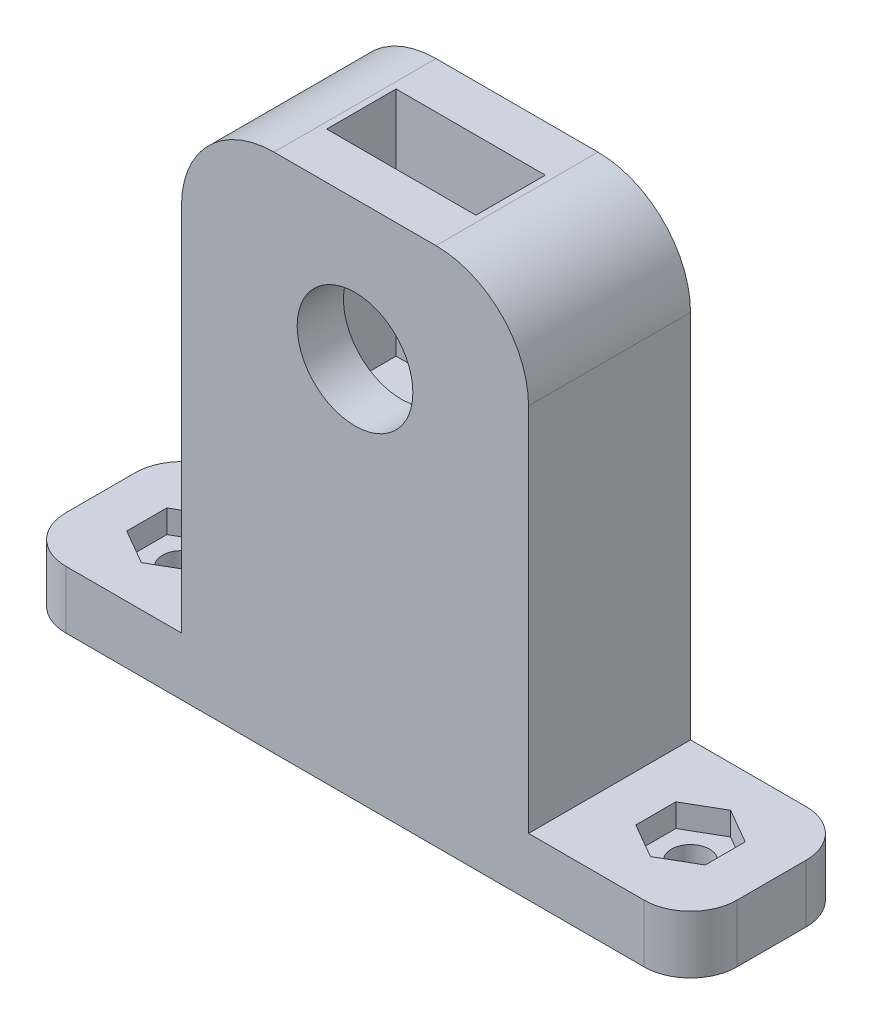
ISO-10303-21;
HEADER;
FILE_DESCRIPTION(('STEP AP214'),'2;1');
FILE_NAME('part.step','',(''),(''),'','','');
FILE_SCHEMA(('AUTOMOTIVE_DESIGN { 1 0 10303 214 1 1 1 1 }'));
ENDSEC;
DATA;
#1=APPLICATION_CONTEXT('core data for automotive mechanical design processes');
#2=APPLICATION_PROTOCOL_DEFINITION('international standard','automotive_design',2000,#1);
#3=PRODUCT_CONTEXT('',#1,'mechanical');
#4=PRODUCT('Part','Part','',(#3));
#5=PRODUCT_RELATED_PRODUCT_CATEGORY('part','',(#4));
#6=PRODUCT_DEFINITION_FORMATION('','',#4);
#7=PRODUCT_DEFINITION_CONTEXT('part definition',#1,'design');
#8=PRODUCT_DEFINITION('design','',#6,#7);
#9=PRODUCT_DEFINITION_SHAPE('','',#8);
#10=(LENGTH_UNIT() NAMED_UNIT(*) SI_UNIT(.MILLI.,.METRE.));
#11=(NAMED_UNIT(*) PLANE_ANGLE_UNIT() SI_UNIT($,.RADIAN.));
#12=(NAMED_UNIT(*) SI_UNIT($,.STERADIAN.) SOLID_ANGLE_UNIT());
#13=UNCERTAINTY_MEASURE_WITH_UNIT(LENGTH_MEASURE(1.E-05),#10,'distance_accuracy_value','');
#14=(GEOMETRIC_REPRESENTATION_CONTEXT(3) GLOBAL_UNCERTAINTY_ASSIGNED_CONTEXT((#13)) GLOBAL_UNIT_ASSIGNED_CONTEXT((#10,
#11,#12)) REPRESENTATION_CONTEXT('',''));
#15=CARTESIAN_POINT('',(0.,0.,0.));
#16=DIRECTION('',(0.,0.,1.));
#17=DIRECTION('',(1.,0.,0.));
#18=AXIS2_PLACEMENT_3D('',#15,#16,#17);
#19=CARTESIAN_POINT('',(0.,0.,249.002));
#20=DIRECTION('',(0.,0.,-1.));
#21=DIRECTION('',(-1.,0.,0.));
#22=AXIS2_PLACEMENT_3D('',#19,#20,#21);
#23=CYLINDRICAL_SURFACE('',#22,5.);
#24=CARTESIAN_POINT('',(0.,0.,249.));
#25=DIRECTION('',(0.,0.,1.));
#26=DIRECTION('',(1.,0.,0.));
#27=AXIS2_PLACEMENT_3D('',#24,#25,#26);
#28=CIRCLE('',#27,5.);
#29=CARTESIAN_POINT('',(4.99999999999993,0.,249.));
#30=VERTEX_POINT('',#29);
#31=EDGE_CURVE('E488',#30,#30,#28,.F.);
#32=ORIENTED_EDGE('',*,*,#31,.F.);
#33=EDGE_LOOP('',(#32));
#34=FACE_BOUND('',#33,.T.);
#35=CARTESIAN_POINT('',(0.,0.,245.));
#36=DIRECTION('',(0.,0.,-1.));
#37=DIRECTION('',(-1.,0.,0.));
#38=AXIS2_PLACEMENT_3D('',#35,#36,#37);
#39=CIRCLE('',#38,5.);
#40=CARTESIAN_POINT('',(-5.00000000000007,0.,245.));
#41=VERTEX_POINT('',#40);
#42=EDGE_CURVE('E292',#41,#41,#39,.F.);
#43=ORIENTED_EDGE('',*,*,#42,.F.);
#44=EDGE_LOOP('',(#43));
#45=FACE_BOUND('',#44,.T.);
#46=ADVANCED_FACE('F16',(#34,#45),#23,.F.);
#47=CARTESIAN_POINT('',(0.,12.,234.5));
#48=DIRECTION('',(0.,1.,0.));
#49=DIRECTION('',(-1.,0.,0.));
#50=AXIS2_PLACEMENT_3D('',#47,#48,#49);
#51=PLANE('',#50);
#52=DIRECTION('',(-1.,0.,0.));
#53=VECTOR('',#52,1.);
#54=CARTESIAN_POINT('',(-1.83801206739109,12.,235.));
#55=LINE('',#54,#53);
#56=CARTESIAN_POINT('',(7.,12.,235.));
#57=VERTEX_POINT('',#56);
#58=CARTESIAN_POINT('',(-7.00000000000009,12.,235.));
#59=VERTEX_POINT('',#58);
#60=EDGE_CURVE('E531',#57,#59,#55,.T.);
#61=ORIENTED_EDGE('',*,*,#60,.T.);
#62=DIRECTION('',(0.,0.,-1.));
#63=VECTOR('',#62,1.);
#64=CARTESIAN_POINT('',(-7.00000000000009,12.,234.5));
#65=LINE('',#64,#63);
#66=CARTESIAN_POINT('',(-7.00000000000009,12.,249.));
#67=VERTEX_POINT('',#66);
#68=EDGE_CURVE('E572',#59,#67,#65,.F.);
#69=ORIENTED_EDGE('',*,*,#68,.T.);
#70=DIRECTION('',(-1.,0.,0.));
#71=VECTOR('',#70,1.);
#72=CARTESIAN_POINT('',(-0.753437634557487,12.,249.));
#73=LINE('',#72,#71);
#74=CARTESIAN_POINT('',(7.,12.,249.));
#75=VERTEX_POINT('',#74);
#76=EDGE_CURVE('E535',#75,#67,#73,.T.);
#77=ORIENTED_EDGE('',*,*,#76,.F.);
#78=DIRECTION('',(0.,0.,-1.));
#79=VECTOR('',#78,1.);
#80=CARTESIAN_POINT('',(7.,12.,235.));
#81=LINE('',#80,#79);
#82=EDGE_CURVE('E568',#75,#57,#81,.T.);
#83=ORIENTED_EDGE('',*,*,#82,.T.);
#84=EDGE_LOOP('',(#61,#69,#77,#83));
#85=FACE_BOUND('',#84,.T.);
#86=DIRECTION('',(0.,0.,-1.));
#87=VECTOR('',#86,1.);
#88=CARTESIAN_POINT('',(6.44999999999992,12.,242.));
#89=LINE('',#88,#87);
#90=CARTESIAN_POINT('',(6.44999999999992,12.,245.));
#91=VERTEX_POINT('',#90);
#92=CARTESIAN_POINT('',(6.44999999999992,12.,239.));
#93=VERTEX_POINT('',#92);
#94=EDGE_CURVE('E327',#91,#93,#89,.T.);
#95=ORIENTED_EDGE('',*,*,#94,.F.);
#96=DIRECTION('',(-1.,0.,0.));
#97=VECTOR('',#96,1.);
#98=CARTESIAN_POINT('',(0.,12.,245.));
#99=LINE('',#98,#97);
#100=CARTESIAN_POINT('',(-6.45000000000008,12.,245.));
#101=VERTEX_POINT('',#100);
#102=EDGE_CURVE('E287',#91,#101,#99,.T.);
#103=ORIENTED_EDGE('',*,*,#102,.T.);
#104=DIRECTION('',(0.,0.,-1.));
#105=VECTOR('',#104,1.);
#106=CARTESIAN_POINT('',(-6.45000000000008,12.,242.));
#107=LINE('',#106,#105);
#108=CARTESIAN_POINT('',(-6.45000000000008,12.,239.));
#109=VERTEX_POINT('',#108);
#110=EDGE_CURVE('E308',#101,#109,#107,.T.);
#111=ORIENTED_EDGE('',*,*,#110,.T.);
#112=DIRECTION('',(-1.,0.,0.));
#113=VECTOR('',#112,1.);
#114=CARTESIAN_POINT('',(0.,12.,239.));
#115=LINE('',#114,#113);
#116=EDGE_CURVE('E315',#93,#109,#115,.T.);
#117=ORIENTED_EDGE('',*,*,#116,.F.);
#118=EDGE_LOOP('',(#95,#103,#111,#117));
#119=FACE_BOUND('',#118,.T.);
#120=ADVANCED_FACE('F686',(#85,#119),#51,.T.);
#121=CARTESIAN_POINT('',(0.,-28.,234.5));
#122=DIRECTION('',(0.,1.,0.));
#123=DIRECTION('',(-1.,0.,0.));
#124=AXIS2_PLACEMENT_3D('',#121,#122,#123);
#125=PLANE('',#124);
#126=DIRECTION('',(0.,0.,-1.));
#127=VECTOR('',#126,1.);
#128=CARTESIAN_POINT('',(29.,-28.,243.239441037178));
#129=LINE('',#128,#127);
#130=CARTESIAN_POINT('',(29.,-28.,245.));
#131=VERTEX_POINT('',#130);
#132=CARTESIAN_POINT('',(29.,-28.,239.));
#133=VERTEX_POINT('',#132);
#134=EDGE_CURVE('E517',#131,#133,#129,.T.);
#135=ORIENTED_EDGE('',*,*,#134,.T.);
#136=CARTESIAN_POINT('',(25.,-28.,239.));
#137=DIRECTION('',(0.,1.,0.));
#138=DIRECTION('',(-1.,0.,0.));
#139=AXIS2_PLACEMENT_3D('',#136,#137,#138);
#140=CIRCLE('',#139,4.);
#141=CARTESIAN_POINT('',(25.,-28.,235.));
#142=VERTEX_POINT('',#141);
#143=EDGE_CURVE('E10',#133,#142,#140,.T.);
#144=ORIENTED_EDGE('',*,*,#143,.T.);
#145=DIRECTION('',(1.,0.,0.));
#146=VECTOR('',#145,1.);
#147=CARTESIAN_POINT('',(18.5549584478139,-28.,235.));
#148=LINE('',#147,#146);
#149=CARTESIAN_POINT('',(15.,-28.,235.));
#150=VERTEX_POINT('',#149);
#151=EDGE_CURVE('E513',#150,#142,#148,.T.);
#152=ORIENTED_EDGE('',*,*,#151,.F.);
#153=DIRECTION('',(0.,0.,-1.));
#154=VECTOR('',#153,1.);
#155=CARTESIAN_POINT('',(15.,-28.,243.239441037178));
#156=LINE('',#155,#154);
#157=CARTESIAN_POINT('',(15.,-28.,249.));
#158=VERTEX_POINT('',#157);
#159=EDGE_CURVE('E524',#158,#150,#156,.T.);
#160=ORIENTED_EDGE('',*,*,#159,.F.);
#161=DIRECTION('',(1.,0.,0.));
#162=VECTOR('',#161,1.);
#163=CARTESIAN_POINT('',(23.445041552186,-28.,249.));
#164=LINE('',#163,#162);
#165=CARTESIAN_POINT('',(25.,-28.,249.));
#166=VERTEX_POINT('',#165);
#167=EDGE_CURVE('E520',#158,#166,#164,.T.);
#168=ORIENTED_EDGE('',*,*,#167,.T.);
#169=CARTESIAN_POINT('',(25.,-28.,245.));
#170=DIRECTION('',(0.,1.,0.));
#171=DIRECTION('',(-1.,0.,0.));
#172=AXIS2_PLACEMENT_3D('',#169,#170,#171);
#173=CIRCLE('',#172,4.);
#174=EDGE_CURVE('E25',#166,#131,#173,.T.);
#175=ORIENTED_EDGE('',*,*,#174,.T.);
#176=EDGE_LOOP('',(#135,#144,#152,#160,#168,#175));
#177=FACE_BOUND('',#176,.T.);
#178=DIRECTION('',(0.,0.,1.));
#179=VECTOR('',#178,1.);
#180=CARTESIAN_POINT('',(25.,-28.,242.));
#181=LINE('',#180,#179);
#182=CARTESIAN_POINT('',(25.,-28.,240.267949192431));
#183=VERTEX_POINT('',#182);
#184=CARTESIAN_POINT('',(25.,-28.,243.732050807569));
#185=VERTEX_POINT('',#184);
#186=EDGE_CURVE('E376',#183,#185,#181,.T.);
#187=ORIENTED_EDGE('',*,*,#186,.T.);
#188=DIRECTION('',(-0.86602540378444,0.,0.5));
#189=VECTOR('',#188,1.);
#190=CARTESIAN_POINT('',(23.5,-28.,244.598076211353));
#191=LINE('',#190,#189);
#192=CARTESIAN_POINT('',(22.,-28.,245.464101615137));
#193=VERTEX_POINT('',#192);
#194=EDGE_CURVE('E372',#185,#193,#191,.T.);
#195=ORIENTED_EDGE('',*,*,#194,.T.);
#196=DIRECTION('',(-0.866025403784437,0.,-0.5));
#197=VECTOR('',#196,1.);
#198=CARTESIAN_POINT('',(20.5,-28.,244.598076211353));
#199=LINE('',#198,#197);
#200=CARTESIAN_POINT('',(19.,-28.,243.732050807569));
#201=VERTEX_POINT('',#200);
#202=EDGE_CURVE('E347',#193,#201,#199,.T.);
#203=ORIENTED_EDGE('',*,*,#202,.T.);
#204=DIRECTION('',(0.,0.,-1.));
#205=VECTOR('',#204,1.);
#206=CARTESIAN_POINT('',(19.,-28.,242.));
#207=LINE('',#206,#205);
#208=CARTESIAN_POINT('',(19.,-28.,240.267949192431));
#209=VERTEX_POINT('',#208);
#210=EDGE_CURVE('E389',#201,#209,#207,.T.);
#211=ORIENTED_EDGE('',*,*,#210,.T.);
#212=DIRECTION('',(0.86602540378444,0.,-0.5));
#213=VECTOR('',#212,1.);
#214=CARTESIAN_POINT('',(20.5,-28.,239.401923788646));
#215=LINE('',#214,#213);
#216=CARTESIAN_POINT('',(22.,-28.,238.535898384862));
#217=VERTEX_POINT('',#216);
#218=EDGE_CURVE('E385',#209,#217,#215,.T.);
#219=ORIENTED_EDGE('',*,*,#218,.T.);
#220=DIRECTION('',(0.866025403784438,0.,0.5));
#221=VECTOR('',#220,1.);
#222=CARTESIAN_POINT('',(23.5,-28.,239.401923788646));
#223=LINE('',#222,#221);
#224=EDGE_CURVE('E381',#217,#183,#223,.T.);
#225=ORIENTED_EDGE('',*,*,#224,.T.);
#226=EDGE_LOOP('',(#187,#195,#203,#211,#219,#225));
#227=FACE_BOUND('',#226,.T.);
#228=ADVANCED_FACE('F635',(#177,#227),#125,.T.);
#229=CARTESIAN_POINT('',(0.,-28.,234.5));
#230=DIRECTION('',(0.,1.,0.));
#231=DIRECTION('',(-1.,0.,0.));
#232=AXIS2_PLACEMENT_3D('',#229,#230,#231);
#233=PLANE('',#232);
#234=DIRECTION('',(-1.,0.,0.));
#235=VECTOR('',#234,1.);
#236=CARTESIAN_POINT('',(-22.1077051758766,-28.,235.));
#237=LINE('',#236,#235);
#238=CARTESIAN_POINT('',(-15.,-28.,235.));
#239=VERTEX_POINT('',#238);
#240=CARTESIAN_POINT('',(-25.,-28.,235.));
#241=VERTEX_POINT('',#240);
#242=EDGE_CURVE('E501',#239,#241,#237,.T.);
#243=ORIENTED_EDGE('',*,*,#242,.T.);
#244=CARTESIAN_POINT('',(-25.,-28.,239.));
#245=DIRECTION('',(0.,1.,0.));
#246=DIRECTION('',(-1.,0.,0.));
#247=AXIS2_PLACEMENT_3D('',#244,#245,#246);
#248=CIRCLE('',#247,4.);
#249=CARTESIAN_POINT('',(-29.,-28.,239.));
#250=VERTEX_POINT('',#249);
#251=EDGE_CURVE('E616',#241,#250,#248,.T.);
#252=ORIENTED_EDGE('',*,*,#251,.T.);
#253=DIRECTION('',(0.,0.,-1.));
#254=VECTOR('',#253,1.);
#255=CARTESIAN_POINT('',(-29.,-28.,240.266503512859));
#256=LINE('',#255,#254);
#257=CARTESIAN_POINT('',(-29.,-28.,245.));
#258=VERTEX_POINT('',#257);
#259=EDGE_CURVE('E505',#258,#250,#256,.T.);
#260=ORIENTED_EDGE('',*,*,#259,.F.);
#261=CARTESIAN_POINT('',(-25.,-28.,245.));
#262=DIRECTION('',(0.,1.,0.));
#263=DIRECTION('',(-1.,0.,0.));
#264=AXIS2_PLACEMENT_3D('',#261,#262,#263);
#265=CIRCLE('',#264,4.);
#266=CARTESIAN_POINT('',(-25.,-28.,249.));
#267=VERTEX_POINT('',#266);
#268=EDGE_CURVE('E613',#258,#267,#265,.T.);
#269=ORIENTED_EDGE('',*,*,#268,.T.);
#270=DIRECTION('',(-1.,0.,0.));
#271=VECTOR('',#270,1.);
#272=CARTESIAN_POINT('',(-22.1077051758766,-28.,249.));
#273=LINE('',#272,#271);
#274=CARTESIAN_POINT('',(-15.,-28.,249.));
#275=VERTEX_POINT('',#274);
#276=EDGE_CURVE('E493',#275,#267,#273,.T.);
#277=ORIENTED_EDGE('',*,*,#276,.F.);
#278=DIRECTION('',(0.,0.,-1.));
#279=VECTOR('',#278,1.);
#280=CARTESIAN_POINT('',(-15.,-28.,243.73349648714));
#281=LINE('',#280,#279);
#282=EDGE_CURVE('E497',#275,#239,#281,.T.);
#283=ORIENTED_EDGE('',*,*,#282,.T.);
#284=EDGE_LOOP('',(#243,#252,#260,#269,#277,#283));
#285=FACE_BOUND('',#284,.T.);
#286=DIRECTION('',(-0.866025403784439,0.,0.5));
#287=VECTOR('',#286,1.);
#288=CARTESIAN_POINT('',(-20.5,-28.,244.598076211353));
#289=LINE('',#288,#287);
#290=CARTESIAN_POINT('',(-19.,-28.,243.732050807569));
#291=VERTEX_POINT('',#290);
#292=CARTESIAN_POINT('',(-22.,-28.,245.464101615138));
#293=VERTEX_POINT('',#292);
#294=EDGE_CURVE('E444',#291,#293,#289,.T.);
#295=ORIENTED_EDGE('',*,*,#294,.T.);
#296=DIRECTION('',(-0.866025403784437,0.,-0.5));
#297=VECTOR('',#296,1.);
#298=CARTESIAN_POINT('',(-23.5,-28.,244.598076211353));
#299=LINE('',#298,#297);
#300=CARTESIAN_POINT('',(-25.,-28.,243.732050807569));
#301=VERTEX_POINT('',#300);
#302=EDGE_CURVE('E341',#293,#301,#299,.T.);
#303=ORIENTED_EDGE('',*,*,#302,.T.);
#304=DIRECTION('',(0.,0.,-1.));
#305=VECTOR('',#304,1.);
#306=CARTESIAN_POINT('',(-25.,-28.,242.));
#307=LINE('',#306,#305);
#308=CARTESIAN_POINT('',(-25.,-28.,240.267949192431));
#309=VERTEX_POINT('',#308);
#310=EDGE_CURVE('E420',#301,#309,#307,.T.);
#311=ORIENTED_EDGE('',*,*,#310,.T.);
#312=DIRECTION('',(0.86602540378444,0.,-0.5));
#313=VECTOR('',#312,1.);
#314=CARTESIAN_POINT('',(-23.5,-28.,239.401923788646));
#315=LINE('',#314,#313);
#316=CARTESIAN_POINT('',(-22.,-28.,238.535898384862));
#317=VERTEX_POINT('',#316);
#318=EDGE_CURVE('E456',#309,#317,#315,.T.);
#319=ORIENTED_EDGE('',*,*,#318,.T.);
#320=DIRECTION('',(0.866025403784437,0.,0.5));
#321=VECTOR('',#320,1.);
#322=CARTESIAN_POINT('',(-20.5,-28.,239.401923788646));
#323=LINE('',#322,#321);
#324=CARTESIAN_POINT('',(-19.,-28.,240.267949192431));
#325=VERTEX_POINT('',#324);
#326=EDGE_CURVE('E452',#317,#325,#323,.T.);
#327=ORIENTED_EDGE('',*,*,#326,.T.);
#328=DIRECTION('',(0.,0.,1.));
#329=VECTOR('',#328,1.);
#330=CARTESIAN_POINT('',(-19.,-28.,242.));
#331=LINE('',#330,#329);
#332=EDGE_CURVE('E448',#325,#291,#331,.T.);
#333=ORIENTED_EDGE('',*,*,#332,.T.);
#334=EDGE_LOOP('',(#295,#303,#311,#319,#327,#333));
#335=FACE_BOUND('',#334,.T.);
#336=ADVANCED_FACE('F699',(#285,#335),#233,.T.);
#337=CARTESIAN_POINT('',(-22.,-39.002,242.));
#338=DIRECTION('',(0.,1.,0.));
#339=DIRECTION('',(-1.,0.,0.));
#340=AXIS2_PLACEMENT_3D('',#337,#338,#339);
#341=CYLINDRICAL_SURFACE('',#340,1.65);
#342=CARTESIAN_POINT('',(-22.,-33.,242.));
#343=DIRECTION('',(0.,1.,0.));
#344=DIRECTION('',(-1.,0.,0.));
#345=AXIS2_PLACEMENT_3D('',#342,#343,#344);
#346=CIRCLE('',#345,1.65);
#347=CARTESIAN_POINT('',(-23.65,-33.,242.));
#348=VERTEX_POINT('',#347);
#349=EDGE_CURVE('E480',#348,#348,#346,.T.);
#350=ORIENTED_EDGE('',*,*,#349,.F.);
#351=EDGE_LOOP('',(#350));
#352=FACE_BOUND('',#351,.T.);
#353=CARTESIAN_POINT('',(-22.,-30.,242.));
#354=DIRECTION('',(0.,1.,0.));
#355=DIRECTION('',(-1.,0.,0.));
#356=AXIS2_PLACEMENT_3D('',#353,#354,#355);
#357=CIRCLE('',#356,1.65);
#358=CARTESIAN_POINT('',(-23.65,-30.,242.));
#359=VERTEX_POINT('',#358);
#360=EDGE_CURVE('E414',#359,#359,#357,.F.);
#361=ORIENTED_EDGE('',*,*,#360,.F.);
#362=EDGE_LOOP('',(#361));
#363=FACE_BOUND('',#362,.T.);
#364=ADVANCED_FACE('F702',(#352,#363),#341,.F.);
#365=CARTESIAN_POINT('',(22.,-39.002,242.));
#366=DIRECTION('',(0.,1.,0.));
#367=DIRECTION('',(-1.,0.,0.));
#368=AXIS2_PLACEMENT_3D('',#365,#366,#367);
#369=CYLINDRICAL_SURFACE('',#368,1.65);
#370=CARTESIAN_POINT('',(22.,-33.,242.));
#371=DIRECTION('',(0.,1.,0.));
#372=DIRECTION('',(-1.,0.,0.));
#373=AXIS2_PLACEMENT_3D('',#370,#371,#372);
#374=CIRCLE('',#373,1.65);
#375=CARTESIAN_POINT('',(20.35,-33.,242.));
#376=VERTEX_POINT('',#375);
#377=EDGE_CURVE('E484',#376,#376,#374,.T.);
#378=ORIENTED_EDGE('',*,*,#377,.F.);
#379=EDGE_LOOP('',(#378));
#380=FACE_BOUND('',#379,.T.);
#381=CARTESIAN_POINT('',(22.,-30.,242.));
#382=DIRECTION('',(0.,1.,0.));
#383=DIRECTION('',(-1.,0.,0.));
#384=AXIS2_PLACEMENT_3D('',#381,#382,#383);
#385=CIRCLE('',#384,1.65);
#386=CARTESIAN_POINT('',(20.35,-30.,242.));
#387=VERTEX_POINT('',#386);
#388=EDGE_CURVE('E367',#387,#387,#385,.T.);
#389=ORIENTED_EDGE('',*,*,#388,.T.);
#390=EDGE_LOOP('',(#389));
#391=FACE_BOUND('',#390,.T.);
#392=ADVANCED_FACE('F736',(#380,#391),#369,.F.);
#393=CARTESIAN_POINT('',(-1.83801206739109,12.,235.));
#394=DIRECTION('',(0.,0.,1.));
#395=DIRECTION('',(1.,0.,0.));
#396=AXIS2_PLACEMENT_3D('',#393,#394,#395);
#397=PLANE('',#396);
#398=DIRECTION('',(-1.,0.,0.));
#399=VECTOR('',#398,1.);
#400=CARTESIAN_POINT('',(-1.83801206739108,-33.,235.));
#401=LINE('',#400,#399);
#402=CARTESIAN_POINT('',(25.,-33.,235.));
#403=VERTEX_POINT('',#402);
#404=CARTESIAN_POINT('',(-25.,-33.,235.));
#405=VERTEX_POINT('',#404);
#406=EDGE_CURVE('E528',#403,#405,#401,.T.);
#407=ORIENTED_EDGE('',*,*,#406,.T.);
#408=DIRECTION('',(0.,-1.,0.));
#409=VECTOR('',#408,1.);
#410=CARTESIAN_POINT('',(-25.,-28.,235.));
#411=LINE('',#410,#409);
#412=EDGE_CURVE('E610',#405,#241,#411,.F.);
#413=ORIENTED_EDGE('',*,*,#412,.T.);
#414=ORIENTED_EDGE('',*,*,#242,.F.);
#415=DIRECTION('',(0.,-1.,0.));
#416=VECTOR('',#415,1.);
#417=CARTESIAN_POINT('',(-15.,12.,235.));
#418=LINE('',#417,#416);
#419=CARTESIAN_POINT('',(-15.,4.,235.));
#420=VERTEX_POINT('',#419);
#421=EDGE_CURVE('E552',#420,#239,#418,.T.);
#422=ORIENTED_EDGE('',*,*,#421,.F.);
#423=CARTESIAN_POINT('',(-7.00000000000009,4.,235.));
#424=DIRECTION('',(0.,0.,1.));
#425=DIRECTION('',(1.,0.,0.));
#426=AXIS2_PLACEMENT_3D('',#423,#424,#425);
#427=CIRCLE('',#426,8.);
#428=EDGE_CURVE('E565',#420,#59,#427,.F.);
#429=ORIENTED_EDGE('',*,*,#428,.T.);
#430=ORIENTED_EDGE('',*,*,#60,.F.);
#431=CARTESIAN_POINT('',(7.,4.,235.));
#432=DIRECTION('',(0.,0.,1.));
#433=DIRECTION('',(1.,0.,0.));
#434=AXIS2_PLACEMENT_3D('',#431,#432,#433);
#435=CIRCLE('',#434,8.);
#436=CARTESIAN_POINT('',(15.,4.,235.));
#437=VERTEX_POINT('',#436);
#438=EDGE_CURVE('E562',#57,#437,#435,.F.);
#439=ORIENTED_EDGE('',*,*,#438,.T.);
#440=DIRECTION('',(0.,-1.,0.));
#441=VECTOR('',#440,1.);
#442=CARTESIAN_POINT('',(15.,12.,235.));
#443=LINE('',#442,#441);
#444=EDGE_CURVE('E555',#437,#150,#443,.T.);
#445=ORIENTED_EDGE('',*,*,#444,.T.);
#446=ORIENTED_EDGE('',*,*,#151,.T.);
#447=DIRECTION('',(0.,-1.,0.));
#448=VECTOR('',#447,1.);
#449=CARTESIAN_POINT('',(25.,12.,235.));
#450=LINE('',#449,#448);
#451=EDGE_CURVE('E606',#142,#403,#450,.T.);
#452=ORIENTED_EDGE('',*,*,#451,.T.);
#453=EDGE_LOOP('',(#407,#413,#414,#422,#429,#430,#439,#445,#446,#452));
#454=FACE_BOUND('',#453,.T.);
#455=CARTESIAN_POINT('',(0.,0.,235.));
#456=DIRECTION('',(0.,0.,-1.));
#457=DIRECTION('',(-1.,0.,0.));
#458=AXIS2_PLACEMENT_3D('',#455,#456,#457);
#459=CIRCLE('',#458,5.);
#460=CARTESIAN_POINT('',(-5.00000000000007,0.,235.));
#461=VERTEX_POINT('',#460);
#462=EDGE_CURVE('E318',#461,#461,#459,.T.);
#463=ORIENTED_EDGE('',*,*,#462,.F.);
#464=EDGE_LOOP('',(#463));
#465=FACE_BOUND('',#464,.T.);
#466=ADVANCED_FACE('F667',(#454,#465),#397,.F.);
#467=CARTESIAN_POINT('',(15.,12.,243.239441037178));
#468=DIRECTION('',(-1.,0.,0.));
#469=DIRECTION('',(0.,-1.,0.));
#470=AXIS2_PLACEMENT_3D('',#467,#468,#469);
#471=PLANE('',#470);
#472=ORIENTED_EDGE('',*,*,#444,.F.);
#473=DIRECTION('',(0.,0.,-1.));
#474=VECTOR('',#473,1.);
#475=CARTESIAN_POINT('',(15.,4.,249.));
#476=LINE('',#475,#474);
#477=CARTESIAN_POINT('',(15.,4.,249.));
#478=VERTEX_POINT('',#477);
#479=EDGE_CURVE('E581',#437,#478,#476,.F.);
#480=ORIENTED_EDGE('',*,*,#479,.T.);
#481=DIRECTION('',(0.,-1.,0.));
#482=VECTOR('',#481,1.);
#483=CARTESIAN_POINT('',(15.,12.,249.));
#484=LINE('',#483,#482);
#485=EDGE_CURVE('E540',#478,#158,#484,.T.);
#486=ORIENTED_EDGE('',*,*,#485,.T.);
#487=ORIENTED_EDGE('',*,*,#159,.T.);
#488=EDGE_LOOP('',(#472,#480,#486,#487));
#489=FACE_BOUND('',#488,.T.);
#490=ADVANCED_FACE('F676',(#489),#471,.F.);
#491=CARTESIAN_POINT('',(-15.,12.,243.73349648714));
#492=DIRECTION('',(-1.,0.,0.));
#493=DIRECTION('',(0.,-1.,0.));
#494=AXIS2_PLACEMENT_3D('',#491,#492,#493);
#495=PLANE('',#494);
#496=DIRECTION('',(0.,-1.,0.));
#497=VECTOR('',#496,1.);
#498=CARTESIAN_POINT('',(-15.,12.,249.));
#499=LINE('',#498,#497);
#500=CARTESIAN_POINT('',(-15.,4.,249.));
#501=VERTEX_POINT('',#500);
#502=EDGE_CURVE('E549',#501,#275,#499,.T.);
#503=ORIENTED_EDGE('',*,*,#502,.F.);
#504=DIRECTION('',(0.,0.,-1.));
#505=VECTOR('',#504,1.);
#506=CARTESIAN_POINT('',(-15.,4.,243.73349648714));
#507=LINE('',#506,#505);
#508=EDGE_CURVE('E558',#501,#420,#507,.T.);
#509=ORIENTED_EDGE('',*,*,#508,.T.);
#510=ORIENTED_EDGE('',*,*,#421,.T.);
#511=ORIENTED_EDGE('',*,*,#282,.F.);
#512=EDGE_LOOP('',(#503,#509,#510,#511));
#513=FACE_BOUND('',#512,.T.);
#514=ADVANCED_FACE('F696',(#513),#495,.T.);
#515=CARTESIAN_POINT('',(-0.753437634557487,12.,249.));
#516=DIRECTION('',(0.,0.,1.));
#517=DIRECTION('',(1.,0.,0.));
#518=AXIS2_PLACEMENT_3D('',#515,#516,#517);
#519=PLANE('',#518);
#520=ORIENTED_EDGE('',*,*,#31,.T.);
#521=EDGE_LOOP('',(#520));
#522=FACE_BOUND('',#521,.T.);
#523=ORIENTED_EDGE('',*,*,#276,.T.);
#524=DIRECTION('',(0.,-1.,0.));
#525=VECTOR('',#524,1.);
#526=CARTESIAN_POINT('',(-25.,12.,249.));
#527=LINE('',#526,#525);
#528=CARTESIAN_POINT('',(-25.,-33.,249.));
#529=VERTEX_POINT('',#528);
#530=EDGE_CURVE('E622',#267,#529,#527,.T.);
#531=ORIENTED_EDGE('',*,*,#530,.T.);
#532=DIRECTION('',(-1.,0.,0.));
#533=VECTOR('',#532,1.);
#534=CARTESIAN_POINT('',(-0.753437634557478,-33.,249.));
#535=LINE('',#534,#533);
#536=CARTESIAN_POINT('',(25.,-33.,249.));
#537=VERTEX_POINT('',#536);
#538=EDGE_CURVE('E536',#537,#529,#535,.T.);
#539=ORIENTED_EDGE('',*,*,#538,.F.);
#540=DIRECTION('',(0.,-1.,0.));
#541=VECTOR('',#540,1.);
#542=CARTESIAN_POINT('',(25.,-28.,249.));
#543=LINE('',#542,#541);
#544=EDGE_CURVE('E619',#537,#166,#543,.F.);
#545=ORIENTED_EDGE('',*,*,#544,.T.);
#546=ORIENTED_EDGE('',*,*,#167,.F.);
#547=ORIENTED_EDGE('',*,*,#485,.F.);
#548=CARTESIAN_POINT('',(7.,4.,249.));
#549=DIRECTION('',(0.,0.,1.));
#550=DIRECTION('',(1.,0.,0.));
#551=AXIS2_PLACEMENT_3D('',#548,#549,#550);
#552=CIRCLE('',#551,8.);
#553=EDGE_CURVE('E575',#478,#75,#552,.T.);
#554=ORIENTED_EDGE('',*,*,#553,.T.);
#555=ORIENTED_EDGE('',*,*,#76,.T.);
#556=CARTESIAN_POINT('',(-7.00000000000009,4.,249.));
#557=DIRECTION('',(0.,0.,1.));
#558=DIRECTION('',(1.,0.,0.));
#559=AXIS2_PLACEMENT_3D('',#556,#557,#558);
#560=CIRCLE('',#559,8.);
#561=EDGE_CURVE('E578',#67,#501,#560,.T.);
#562=ORIENTED_EDGE('',*,*,#561,.T.);
#563=ORIENTED_EDGE('',*,*,#502,.T.);
#564=EDGE_LOOP('',(#523,#531,#539,#545,#546,#547,#554,#555,#562,#563));
#565=FACE_BOUND('',#564,.T.);
#566=ADVANCED_FACE('F649',(#522,#565),#519,.T.);
#567=CARTESIAN_POINT('',(0.,-33.,234.5));
#568=DIRECTION('',(0.,1.,0.));
#569=DIRECTION('',(-1.,0.,0.));
#570=AXIS2_PLACEMENT_3D('',#567,#568,#569);
#571=PLANE('',#570);
#572=ORIENTED_EDGE('',*,*,#377,.T.);
#573=EDGE_LOOP('',(#572));
#574=FACE_BOUND('',#573,.T.);
#575=ORIENTED_EDGE('',*,*,#349,.T.);
#576=EDGE_LOOP('',(#575));
#577=FACE_BOUND('',#576,.T.);
#578=DIRECTION('',(0.,0.,-1.));
#579=VECTOR('',#578,1.);
#580=CARTESIAN_POINT('',(-29.,-33.,240.266503512859));
#581=LINE('',#580,#579);
#582=CARTESIAN_POINT('',(-29.,-33.,245.));
#583=VERTEX_POINT('',#582);
#584=CARTESIAN_POINT('',(-29.,-33.,239.));
#585=VERTEX_POINT('',#584);
#586=EDGE_CURVE('E492',#583,#585,#581,.T.);
#587=ORIENTED_EDGE('',*,*,#586,.T.);
#588=CARTESIAN_POINT('',(-25.,-33.,239.));
#589=DIRECTION('',(0.,1.,0.));
#590=DIRECTION('',(-1.,0.,0.));
#591=AXIS2_PLACEMENT_3D('',#588,#589,#590);
#592=CIRCLE('',#591,4.);
#593=EDGE_CURVE('E603',#585,#405,#592,.F.);
#594=ORIENTED_EDGE('',*,*,#593,.T.);
#595=ORIENTED_EDGE('',*,*,#406,.F.);
#596=CARTESIAN_POINT('',(25.,-33.,239.));
#597=DIRECTION('',(0.,1.,0.));
#598=DIRECTION('',(-1.,0.,0.));
#599=AXIS2_PLACEMENT_3D('',#596,#597,#598);
#600=CIRCLE('',#599,4.);
#601=CARTESIAN_POINT('',(29.,-33.,239.));
#602=VERTEX_POINT('',#601);
#603=EDGE_CURVE('E597',#403,#602,#600,.F.);
#604=ORIENTED_EDGE('',*,*,#603,.T.);
#605=DIRECTION('',(0.,0.,-1.));
#606=VECTOR('',#605,1.);
#607=CARTESIAN_POINT('',(29.,-33.,243.239441037178));
#608=LINE('',#607,#606);
#609=CARTESIAN_POINT('',(29.,-33.,245.));
#610=VERTEX_POINT('',#609);
#611=EDGE_CURVE('E509',#610,#602,#608,.T.);
#612=ORIENTED_EDGE('',*,*,#611,.F.);
#613=CARTESIAN_POINT('',(25.,-33.,245.));
#614=DIRECTION('',(0.,1.,0.));
#615=DIRECTION('',(-1.,0.,0.));
#616=AXIS2_PLACEMENT_3D('',#613,#614,#615);
#617=CIRCLE('',#616,4.);
#618=EDGE_CURVE('E594',#610,#537,#617,.F.);
#619=ORIENTED_EDGE('',*,*,#618,.T.);
#620=ORIENTED_EDGE('',*,*,#538,.T.);
#621=CARTESIAN_POINT('',(-25.,-33.,245.));
#622=DIRECTION('',(0.,1.,0.));
#623=DIRECTION('',(-1.,0.,0.));
#624=AXIS2_PLACEMENT_3D('',#621,#622,#623);
#625=CIRCLE('',#624,4.);
#626=EDGE_CURVE('E600',#529,#583,#625,.F.);
#627=ORIENTED_EDGE('',*,*,#626,.T.);
#628=EDGE_LOOP('',(#587,#594,#595,#604,#612,#619,#620,#627));
#629=FACE_BOUND('',#628,.T.);
#630=ADVANCED_FACE('F647',(#574,#577,#629),#571,.F.);
#631=CARTESIAN_POINT('',(29.,-28.,243.239441037178));
#632=DIRECTION('',(-1.,0.,0.));
#633=DIRECTION('',(0.,0.,1.));
#634=AXIS2_PLACEMENT_3D('',#631,#632,#633);
#635=PLANE('',#634);
#636=ORIENTED_EDGE('',*,*,#611,.T.);
#637=DIRECTION('',(0.,-1.,0.));
#638=VECTOR('',#637,1.);
#639=CARTESIAN_POINT('',(29.,-28.,239.));
#640=LINE('',#639,#638);
#641=EDGE_CURVE('E49',#602,#133,#640,.F.);
#642=ORIENTED_EDGE('',*,*,#641,.T.);
#643=ORIENTED_EDGE('',*,*,#134,.F.);
#644=DIRECTION('',(0.,-1.,0.));
#645=VECTOR('',#644,1.);
#646=CARTESIAN_POINT('',(29.,-33.,245.));
#647=LINE('',#646,#645);
#648=EDGE_CURVE('E626',#131,#610,#647,.T.);
#649=ORIENTED_EDGE('',*,*,#648,.T.);
#650=EDGE_LOOP('',(#636,#642,#643,#649));
#651=FACE_BOUND('',#650,.T.);
#652=ADVANCED_FACE('F643',(#651),#635,.F.);
#653=CARTESIAN_POINT('',(-29.,-28.,240.266503512859));
#654=DIRECTION('',(-1.,0.,0.));
#655=DIRECTION('',(0.,-1.,0.));
#656=AXIS2_PLACEMENT_3D('',#653,#654,#655);
#657=PLANE('',#656);
#658=ORIENTED_EDGE('',*,*,#259,.T.);
#659=DIRECTION('',(0.,-1.,0.));
#660=VECTOR('',#659,1.);
#661=CARTESIAN_POINT('',(-29.,-33.,239.));
#662=LINE('',#661,#660);
#663=EDGE_CURVE('E590',#250,#585,#662,.T.);
#664=ORIENTED_EDGE('',*,*,#663,.T.);
#665=ORIENTED_EDGE('',*,*,#586,.F.);
#666=DIRECTION('',(0.,-1.,0.));
#667=VECTOR('',#666,1.);
#668=CARTESIAN_POINT('',(-29.,-28.,245.));
#669=LINE('',#668,#667);
#670=EDGE_CURVE('E584',#583,#258,#669,.F.);
#671=ORIENTED_EDGE('',*,*,#670,.T.);
#672=EDGE_LOOP('',(#658,#664,#665,#671));
#673=FACE_BOUND('',#672,.T.);
#674=ADVANCED_FACE('F658',(#673),#657,.T.);
#675=CARTESIAN_POINT('',(6.44999999999993,-2.960288581401,241.));
#676=DIRECTION('',(-1.,0.,0.));
#677=DIRECTION('',(0.,-1.,0.));
#678=AXIS2_PLACEMENT_3D('',#675,#676,#677);
#679=PLANE('',#678);
#680=DIRECTION('',(0.,1.,0.));
#681=VECTOR('',#680,1.);
#682=CARTESIAN_POINT('',(6.44999999999993,-8.,239.));
#683=LINE('',#682,#681);
#684=CARTESIAN_POINT('',(6.44999999999993,-8.,239.));
#685=VERTEX_POINT('',#684);
#686=EDGE_CURVE('E293',#685,#93,#683,.T.);
#687=ORIENTED_EDGE('',*,*,#686,.F.);
#688=DIRECTION('',(0.,0.,-1.));
#689=VECTOR('',#688,1.);
#690=CARTESIAN_POINT('',(6.44999999999993,-8.,242.));
#691=LINE('',#690,#689);
#692=CARTESIAN_POINT('',(6.44999999999993,-8.,245.));
#693=VERTEX_POINT('',#692);
#694=EDGE_CURVE('E296',#693,#685,#691,.T.);
#695=ORIENTED_EDGE('',*,*,#694,.F.);
#696=DIRECTION('',(0.,1.,0.));
#697=VECTOR('',#696,1.);
#698=CARTESIAN_POINT('',(6.44999999999993,-8.,245.));
#699=LINE('',#698,#697);
#700=EDGE_CURVE('E280',#693,#91,#699,.T.);
#701=ORIENTED_EDGE('',*,*,#700,.T.);
#702=ORIENTED_EDGE('',*,*,#94,.T.);
#703=EDGE_LOOP('',(#687,#695,#701,#702));
#704=FACE_BOUND('',#703,.T.);
#705=ADVANCED_FACE('F297',(#704),#679,.T.);
#706=CARTESIAN_POINT('',(-6.45000000000007,0.,241.));
#707=DIRECTION('',(1.,0.,0.));
#708=DIRECTION('',(0.,1.,0.));
#709=AXIS2_PLACEMENT_3D('',#706,#707,#708);
#710=PLANE('',#709);
#711=DIRECTION('',(0.,1.,0.));
#712=VECTOR('',#711,1.);
#713=CARTESIAN_POINT('',(-6.45000000000007,-8.,239.));
#714=LINE('',#713,#712);
#715=CARTESIAN_POINT('',(-6.45000000000007,-8.,239.));
#716=VERTEX_POINT('',#715);
#717=EDGE_CURVE('E37',#716,#109,#714,.T.);
#718=ORIENTED_EDGE('',*,*,#717,.T.);
#719=ORIENTED_EDGE('',*,*,#110,.F.);
#720=DIRECTION('',(0.,1.,0.));
#721=VECTOR('',#720,1.);
#722=CARTESIAN_POINT('',(-6.45000000000007,-8.,245.));
#723=LINE('',#722,#721);
#724=CARTESIAN_POINT('',(-6.45000000000007,-8.,245.));
#725=VERTEX_POINT('',#724);
#726=EDGE_CURVE('E325',#725,#101,#723,.T.);
#727=ORIENTED_EDGE('',*,*,#726,.F.);
#728=DIRECTION('',(0.,0.,-1.));
#729=VECTOR('',#728,1.);
#730=CARTESIAN_POINT('',(-6.45000000000007,-8.,242.));
#731=LINE('',#730,#729);
#732=EDGE_CURVE('E306',#725,#716,#731,.T.);
#733=ORIENTED_EDGE('',*,*,#732,.T.);
#734=EDGE_LOOP('',(#718,#719,#727,#733));
#735=FACE_BOUND('',#734,.T.);
#736=ADVANCED_FACE('F778',(#735),#710,.T.);
#737=CARTESIAN_POINT('',(-7.00000000000009,4.,243.73349648714));
#738=DIRECTION('',(0.,0.,-1.));
#739=DIRECTION('',(-1.,0.,0.));
#740=AXIS2_PLACEMENT_3D('',#737,#738,#739);
#741=CYLINDRICAL_SURFACE('',#740,8.);
#742=ORIENTED_EDGE('',*,*,#561,.F.);
#743=ORIENTED_EDGE('',*,*,#68,.F.);
#744=ORIENTED_EDGE('',*,*,#428,.F.);
#745=ORIENTED_EDGE('',*,*,#508,.F.);
#746=EDGE_LOOP('',(#742,#743,#744,#745));
#747=FACE_BOUND('',#746,.T.);
#748=ADVANCED_FACE('F693',(#747),#741,.T.);
#749=CARTESIAN_POINT('',(7.,4.,234.5));
#750=DIRECTION('',(0.,0.,1.));
#751=DIRECTION('',(1.,0.,0.));
#752=AXIS2_PLACEMENT_3D('',#749,#750,#751);
#753=CYLINDRICAL_SURFACE('',#752,8.);
#754=ORIENTED_EDGE('',*,*,#553,.F.);
#755=ORIENTED_EDGE('',*,*,#479,.F.);
#756=ORIENTED_EDGE('',*,*,#438,.F.);
#757=ORIENTED_EDGE('',*,*,#82,.F.);
#758=EDGE_LOOP('',(#754,#755,#756,#757));
#759=FACE_BOUND('',#758,.T.);
#760=ADVANCED_FACE('F683',(#759),#753,.T.);
#761=CARTESIAN_POINT('',(23.5,-30.,244.598076211353));
#762=DIRECTION('',(-0.5,0.,-0.86602540378444));
#763=DIRECTION('',(-0.86602540378444,0.,0.5));
#764=AXIS2_PLACEMENT_3D('',#761,#762,#763);
#765=PLANE('',#764);
#766=ORIENTED_EDGE('',*,*,#194,.F.);
#767=DIRECTION('',(0.,1.,0.));
#768=VECTOR('',#767,1.);
#769=CARTESIAN_POINT('',(25.,-30.,243.732050807569));
#770=LINE('',#769,#768);
#771=CARTESIAN_POINT('',(25.,-30.,243.732050807569));
#772=VERTEX_POINT('',#771);
#773=EDGE_CURVE('E411',#772,#185,#770,.T.);
#774=ORIENTED_EDGE('',*,*,#773,.F.);
#775=DIRECTION('',(-0.86602540378444,0.,0.5));
#776=VECTOR('',#775,1.);
#777=CARTESIAN_POINT('',(23.5,-30.,244.598076211353));
#778=LINE('',#777,#776);
#779=CARTESIAN_POINT('',(22.,-30.,245.464101615137));
#780=VERTEX_POINT('',#779);
#781=EDGE_CURVE('E342',#772,#780,#778,.T.);
#782=ORIENTED_EDGE('',*,*,#781,.T.);
#783=DIRECTION('',(0.,1.,0.));
#784=VECTOR('',#783,1.);
#785=CARTESIAN_POINT('',(22.,-30.,245.464101615137));
#786=LINE('',#785,#784);
#787=EDGE_CURVE('E371',#780,#193,#786,.T.);
#788=ORIENTED_EDGE('',*,*,#787,.T.);
#789=EDGE_LOOP('',(#766,#774,#782,#788));
#790=FACE_BOUND('',#789,.T.);
#791=ADVANCED_FACE('F781',(#790),#765,.T.);
#792=CARTESIAN_POINT('',(25.,-30.,242.));
#793=DIRECTION('',(-1.,0.,0.));
#794=DIRECTION('',(0.,0.,1.));
#795=AXIS2_PLACEMENT_3D('',#792,#793,#794);
#796=PLANE('',#795);
#797=ORIENTED_EDGE('',*,*,#186,.F.);
#798=DIRECTION('',(0.,1.,0.));
#799=VECTOR('',#798,1.);
#800=CARTESIAN_POINT('',(25.,-30.,240.267949192431));
#801=LINE('',#800,#799);
#802=CARTESIAN_POINT('',(25.,-30.,240.267949192431));
#803=VERTEX_POINT('',#802);
#804=EDGE_CURVE('E408',#803,#183,#801,.T.);
#805=ORIENTED_EDGE('',*,*,#804,.F.);
#806=DIRECTION('',(0.,0.,1.));
#807=VECTOR('',#806,1.);
#808=CARTESIAN_POINT('',(25.,-30.,242.));
#809=LINE('',#808,#807);
#810=EDGE_CURVE('E346',#803,#772,#809,.T.);
#811=ORIENTED_EDGE('',*,*,#810,.T.);
#812=ORIENTED_EDGE('',*,*,#773,.T.);
#813=EDGE_LOOP('',(#797,#805,#811,#812));
#814=FACE_BOUND('',#813,.T.);
#815=ADVANCED_FACE('F819',(#814),#796,.T.);
#816=CARTESIAN_POINT('',(23.5,-30.,239.401923788646));
#817=DIRECTION('',(-0.5,0.,0.866025403784438));
#818=DIRECTION('',(0.866025403784438,0.,0.5));
#819=AXIS2_PLACEMENT_3D('',#816,#817,#818);
#820=PLANE('',#819);
#821=ORIENTED_EDGE('',*,*,#224,.F.);
#822=DIRECTION('',(0.,1.,0.));
#823=VECTOR('',#822,1.);
#824=CARTESIAN_POINT('',(22.,-30.,238.535898384862));
#825=LINE('',#824,#823);
#826=CARTESIAN_POINT('',(22.,-30.,238.535898384862));
#827=VERTEX_POINT('',#826);
#828=EDGE_CURVE('E405',#827,#217,#825,.T.);
#829=ORIENTED_EDGE('',*,*,#828,.F.);
#830=DIRECTION('',(0.866025403784438,0.,0.5));
#831=VECTOR('',#830,1.);
#832=CARTESIAN_POINT('',(23.5,-30.,239.401923788646));
#833=LINE('',#832,#831);
#834=EDGE_CURVE('E351',#827,#803,#833,.T.);
#835=ORIENTED_EDGE('',*,*,#834,.T.);
#836=ORIENTED_EDGE('',*,*,#804,.T.);
#837=EDGE_LOOP('',(#821,#829,#835,#836));
#838=FACE_BOUND('',#837,.T.);
#839=ADVANCED_FACE('F815',(#838),#820,.T.);
#840=CARTESIAN_POINT('',(20.5,-30.,239.401923788646));
#841=DIRECTION('',(0.5,0.,0.86602540378444));
#842=DIRECTION('',(0.86602540378444,0.,-0.5));
#843=AXIS2_PLACEMENT_3D('',#840,#841,#842);
#844=PLANE('',#843);
#845=ORIENTED_EDGE('',*,*,#218,.F.);
#846=DIRECTION('',(0.,1.,0.));
#847=VECTOR('',#846,1.);
#848=CARTESIAN_POINT('',(19.,-30.,240.267949192431));
#849=LINE('',#848,#847);
#850=CARTESIAN_POINT('',(19.,-30.,240.267949192431));
#851=VERTEX_POINT('',#850);
#852=EDGE_CURVE('E402',#851,#209,#849,.T.);
#853=ORIENTED_EDGE('',*,*,#852,.F.);
#854=DIRECTION('',(0.86602540378444,0.,-0.5));
#855=VECTOR('',#854,1.);
#856=CARTESIAN_POINT('',(20.5,-30.,239.401923788646));
#857=LINE('',#856,#855);
#858=EDGE_CURVE('E355',#851,#827,#857,.T.);
#859=ORIENTED_EDGE('',*,*,#858,.T.);
#860=ORIENTED_EDGE('',*,*,#828,.T.);
#861=EDGE_LOOP('',(#845,#853,#859,#860));
#862=FACE_BOUND('',#861,.T.);
#863=ADVANCED_FACE('F811',(#862),#844,.T.);
#864=CARTESIAN_POINT('',(19.,-30.,242.));
#865=DIRECTION('',(1.,0.,0.));
#866=DIRECTION('',(0.,0.,-1.));
#867=AXIS2_PLACEMENT_3D('',#864,#865,#866);
#868=PLANE('',#867);
#869=ORIENTED_EDGE('',*,*,#210,.F.);
#870=DIRECTION('',(0.,1.,0.));
#871=VECTOR('',#870,1.);
#872=CARTESIAN_POINT('',(19.,-30.,243.732050807569));
#873=LINE('',#872,#871);
#874=CARTESIAN_POINT('',(19.,-30.,243.732050807569));
#875=VERTEX_POINT('',#874);
#876=EDGE_CURVE('E398',#875,#201,#873,.T.);
#877=ORIENTED_EDGE('',*,*,#876,.F.);
#878=DIRECTION('',(0.,0.,-1.));
#879=VECTOR('',#878,1.);
#880=CARTESIAN_POINT('',(19.,-30.,242.));
#881=LINE('',#880,#879);
#882=EDGE_CURVE('E359',#875,#851,#881,.T.);
#883=ORIENTED_EDGE('',*,*,#882,.T.);
#884=ORIENTED_EDGE('',*,*,#852,.T.);
#885=EDGE_LOOP('',(#869,#877,#883,#884));
#886=FACE_BOUND('',#885,.T.);
#887=ADVANCED_FACE('F807',(#886),#868,.T.);
#888=CARTESIAN_POINT('',(20.5,-30.,244.598076211353));
#889=DIRECTION('',(0.5,0.,-0.866025403784437));
#890=DIRECTION('',(-0.866025403784437,0.,-0.5));
#891=AXIS2_PLACEMENT_3D('',#888,#889,#890);
#892=PLANE('',#891);
#893=ORIENTED_EDGE('',*,*,#202,.F.);
#894=ORIENTED_EDGE('',*,*,#787,.F.);
#895=DIRECTION('',(-0.866025403784437,0.,-0.5));
#896=VECTOR('',#895,1.);
#897=CARTESIAN_POINT('',(20.5,-30.,244.598076211353));
#898=LINE('',#897,#896);
#899=EDGE_CURVE('E363',#780,#875,#898,.T.);
#900=ORIENTED_EDGE('',*,*,#899,.T.);
#901=ORIENTED_EDGE('',*,*,#876,.T.);
#902=EDGE_LOOP('',(#893,#894,#900,#901));
#903=FACE_BOUND('',#902,.T.);
#904=ADVANCED_FACE('F803',(#903),#892,.T.);
#905=CARTESIAN_POINT('',(1.99999999999993,-30.,242.));
#906=DIRECTION('',(0.,1.,0.));
#907=DIRECTION('',(-1.,0.,0.));
#908=AXIS2_PLACEMENT_3D('',#905,#906,#907);
#909=PLANE('',#908);
#910=ORIENTED_EDGE('',*,*,#781,.F.);
#911=ORIENTED_EDGE('',*,*,#810,.F.);
#912=ORIENTED_EDGE('',*,*,#834,.F.);
#913=ORIENTED_EDGE('',*,*,#858,.F.);
#914=ORIENTED_EDGE('',*,*,#882,.F.);
#915=ORIENTED_EDGE('',*,*,#899,.F.);
#916=EDGE_LOOP('',(#910,#911,#912,#913,#914,#915));
#917=FACE_BOUND('',#916,.T.);
#918=ORIENTED_EDGE('',*,*,#388,.F.);
#919=EDGE_LOOP('',(#918));
#920=FACE_BOUND('',#919,.T.);
#921=ADVANCED_FACE('F731',(#917,#920),#909,.T.);
#922=CARTESIAN_POINT('',(1.99999999999993,-30.,242.));
#923=DIRECTION('',(0.,1.,0.));
#924=DIRECTION('',(-1.,0.,0.));
#925=AXIS2_PLACEMENT_3D('',#922,#923,#924);
#926=PLANE('',#925);
#927=DIRECTION('',(-0.866025403784437,0.,-0.5));
#928=VECTOR('',#927,1.);
#929=CARTESIAN_POINT('',(-23.5,-30.,244.598076211353));
#930=LINE('',#929,#928);
#931=CARTESIAN_POINT('',(-22.,-30.,245.464101615138));
#932=VERTEX_POINT('',#931);
#933=CARTESIAN_POINT('',(-25.,-30.,243.732050807569));
#934=VERTEX_POINT('',#933);
#935=EDGE_CURVE('E415',#932,#934,#930,.T.);
#936=ORIENTED_EDGE('',*,*,#935,.F.);
#937=DIRECTION('',(-0.866025403784439,0.,0.5));
#938=VECTOR('',#937,1.);
#939=CARTESIAN_POINT('',(-20.5,-30.,244.598076211353));
#940=LINE('',#939,#938);
#941=CARTESIAN_POINT('',(-19.,-30.,243.732050807569));
#942=VERTEX_POINT('',#941);
#943=EDGE_CURVE('E419',#942,#932,#940,.T.);
#944=ORIENTED_EDGE('',*,*,#943,.F.);
#945=DIRECTION('',(0.,0.,1.));
#946=VECTOR('',#945,1.);
#947=CARTESIAN_POINT('',(-19.,-30.,242.));
#948=LINE('',#947,#946);
#949=CARTESIAN_POINT('',(-19.,-30.,240.267949192431));
#950=VERTEX_POINT('',#949);
#951=EDGE_CURVE('E424',#950,#942,#948,.T.);
#952=ORIENTED_EDGE('',*,*,#951,.F.);
#953=DIRECTION('',(0.866025403784437,0.,0.5));
#954=VECTOR('',#953,1.);
#955=CARTESIAN_POINT('',(-20.5,-30.,239.401923788646));
#956=LINE('',#955,#954);
#957=CARTESIAN_POINT('',(-22.,-30.,238.535898384862));
#958=VERTEX_POINT('',#957);
#959=EDGE_CURVE('E428',#958,#950,#956,.T.);
#960=ORIENTED_EDGE('',*,*,#959,.F.);
#961=DIRECTION('',(0.86602540378444,0.,-0.5));
#962=VECTOR('',#961,1.);
#963=CARTESIAN_POINT('',(-23.5,-30.,239.401923788646));
#964=LINE('',#963,#962);
#965=CARTESIAN_POINT('',(-25.,-30.,240.267949192431));
#966=VERTEX_POINT('',#965);
#967=EDGE_CURVE('E432',#966,#958,#964,.T.);
#968=ORIENTED_EDGE('',*,*,#967,.F.);
#969=DIRECTION('',(0.,0.,-1.));
#970=VECTOR('',#969,1.);
#971=CARTESIAN_POINT('',(-25.,-30.,242.));
#972=LINE('',#971,#970);
#973=EDGE_CURVE('E436',#934,#966,#972,.T.);
#974=ORIENTED_EDGE('',*,*,#973,.F.);
#975=EDGE_LOOP('',(#936,#944,#952,#960,#968,#974));
#976=FACE_BOUND('',#975,.T.);
#977=ORIENTED_EDGE('',*,*,#360,.T.);
#978=EDGE_LOOP('',(#977));
#979=FACE_BOUND('',#978,.T.);
#980=ADVANCED_FACE('F728',(#976,#979),#926,.T.);
#981=CARTESIAN_POINT('',(-23.5,-30.,244.598076211353));
#982=DIRECTION('',(0.5,0.,-0.866025403784437));
#983=DIRECTION('',(-0.866025403784437,0.,-0.5));
#984=AXIS2_PLACEMENT_3D('',#981,#982,#983);
#985=PLANE('',#984);
#986=ORIENTED_EDGE('',*,*,#302,.F.);
#987=DIRECTION('',(0.,1.,0.));
#988=VECTOR('',#987,1.);
#989=CARTESIAN_POINT('',(-22.,-30.,245.464101615138));
#990=LINE('',#989,#988);
#991=EDGE_CURVE('E377',#932,#293,#990,.T.);
#992=ORIENTED_EDGE('',*,*,#991,.F.);
#993=ORIENTED_EDGE('',*,*,#935,.T.);
#994=DIRECTION('',(0.,1.,0.));
#995=VECTOR('',#994,1.);
#996=CARTESIAN_POINT('',(-25.,-30.,243.732050807569));
#997=LINE('',#996,#995);
#998=EDGE_CURVE('E440',#934,#301,#997,.T.);
#999=ORIENTED_EDGE('',*,*,#998,.T.);
#1000=EDGE_LOOP('',(#986,#992,#993,#999));
#1001=FACE_BOUND('',#1000,.T.);
#1002=ADVANCED_FACE('F712',(#1001),#985,.T.);
#1003=CARTESIAN_POINT('',(-20.5,-30.,244.598076211353));
#1004=DIRECTION('',(-0.5,0.,-0.866025403784439));
#1005=DIRECTION('',(-0.866025403784439,0.,0.5));
#1006=AXIS2_PLACEMENT_3D('',#1003,#1004,#1005);
#1007=PLANE('',#1006);
#1008=ORIENTED_EDGE('',*,*,#294,.F.);
#1009=DIRECTION('',(0.,1.,0.));
#1010=VECTOR('',#1009,1.);
#1011=CARTESIAN_POINT('',(-19.,-30.,243.732050807569));
#1012=LINE('',#1011,#1010);
#1013=EDGE_CURVE('E475',#942,#291,#1012,.T.);
#1014=ORIENTED_EDGE('',*,*,#1013,.F.);
#1015=ORIENTED_EDGE('',*,*,#943,.T.);
#1016=ORIENTED_EDGE('',*,*,#991,.T.);
#1017=EDGE_LOOP('',(#1008,#1014,#1015,#1016));
#1018=FACE_BOUND('',#1017,.T.);
#1019=ADVANCED_FACE('F708',(#1018),#1007,.T.);
#1020=CARTESIAN_POINT('',(-19.,-30.,242.));
#1021=DIRECTION('',(-1.,0.,0.));
#1022=DIRECTION('',(0.,0.,1.));
#1023=AXIS2_PLACEMENT_3D('',#1020,#1021,#1022);
#1024=PLANE('',#1023);
#1025=ORIENTED_EDGE('',*,*,#332,.F.);
#1026=DIRECTION('',(0.,1.,0.));
#1027=VECTOR('',#1026,1.);
#1028=CARTESIAN_POINT('',(-19.,-30.,240.267949192431));
#1029=LINE('',#1028,#1027);
#1030=EDGE_CURVE('E472',#950,#325,#1029,.T.);
#1031=ORIENTED_EDGE('',*,*,#1030,.F.);
#1032=ORIENTED_EDGE('',*,*,#951,.T.);
#1033=ORIENTED_EDGE('',*,*,#1013,.T.);
#1034=EDGE_LOOP('',(#1025,#1031,#1032,#1033));
#1035=FACE_BOUND('',#1034,.T.);
#1036=ADVANCED_FACE('F726',(#1035),#1024,.T.);
#1037=CARTESIAN_POINT('',(-20.5,-30.,239.401923788646));
#1038=DIRECTION('',(-0.5,0.,0.866025403784437));
#1039=DIRECTION('',(0.866025403784437,0.,0.5));
#1040=AXIS2_PLACEMENT_3D('',#1037,#1038,#1039);
#1041=PLANE('',#1040);
#1042=ORIENTED_EDGE('',*,*,#326,.F.);
#1043=DIRECTION('',(0.,1.,0.));
#1044=VECTOR('',#1043,1.);
#1045=CARTESIAN_POINT('',(-22.,-30.,238.535898384862));
#1046=LINE('',#1045,#1044);
#1047=EDGE_CURVE('E469',#958,#317,#1046,.T.);
#1048=ORIENTED_EDGE('',*,*,#1047,.F.);
#1049=ORIENTED_EDGE('',*,*,#959,.T.);
#1050=ORIENTED_EDGE('',*,*,#1030,.T.);
#1051=EDGE_LOOP('',(#1042,#1048,#1049,#1050));
#1052=FACE_BOUND('',#1051,.T.);
#1053=ADVANCED_FACE('F723',(#1052),#1041,.T.);
#1054=CARTESIAN_POINT('',(-23.5,-30.,239.401923788646));
#1055=DIRECTION('',(0.5,0.,0.86602540378444));
#1056=DIRECTION('',(0.86602540378444,0.,-0.5));
#1057=AXIS2_PLACEMENT_3D('',#1054,#1055,#1056);
#1058=PLANE('',#1057);
#1059=ORIENTED_EDGE('',*,*,#318,.F.);
#1060=DIRECTION('',(0.,1.,0.));
#1061=VECTOR('',#1060,1.);
#1062=CARTESIAN_POINT('',(-25.,-30.,240.267949192431));
#1063=LINE('',#1062,#1061);
#1064=EDGE_CURVE('E465',#966,#309,#1063,.T.);
#1065=ORIENTED_EDGE('',*,*,#1064,.F.);
#1066=ORIENTED_EDGE('',*,*,#967,.T.);
#1067=ORIENTED_EDGE('',*,*,#1047,.T.);
#1068=EDGE_LOOP('',(#1059,#1065,#1066,#1067));
#1069=FACE_BOUND('',#1068,.T.);
#1070=ADVANCED_FACE('F719',(#1069),#1058,.T.);
#1071=CARTESIAN_POINT('',(-25.,-30.,242.));
#1072=DIRECTION('',(1.,0.,0.));
#1073=DIRECTION('',(0.,0.,-1.));
#1074=AXIS2_PLACEMENT_3D('',#1071,#1072,#1073);
#1075=PLANE('',#1074);
#1076=ORIENTED_EDGE('',*,*,#310,.F.);
#1077=ORIENTED_EDGE('',*,*,#998,.F.);
#1078=ORIENTED_EDGE('',*,*,#973,.T.);
#1079=ORIENTED_EDGE('',*,*,#1064,.T.);
#1080=EDGE_LOOP('',(#1076,#1077,#1078,#1079));
#1081=FACE_BOUND('',#1080,.T.);
#1082=ADVANCED_FACE('F716',(#1081),#1075,.T.);
#1083=CARTESIAN_POINT('',(-25.,-28.,239.));
#1084=DIRECTION('',(0.,1.,0.));
#1085=DIRECTION('',(-1.,0.,0.));
#1086=AXIS2_PLACEMENT_3D('',#1083,#1084,#1085);
#1087=CYLINDRICAL_SURFACE('',#1086,4.);
#1088=ORIENTED_EDGE('',*,*,#251,.F.);
#1089=ORIENTED_EDGE('',*,*,#412,.F.);
#1090=ORIENTED_EDGE('',*,*,#593,.F.);
#1091=ORIENTED_EDGE('',*,*,#663,.F.);
#1092=EDGE_LOOP('',(#1088,#1089,#1090,#1091));
#1093=FACE_BOUND('',#1092,.T.);
#1094=ADVANCED_FACE('F663',(#1093),#1087,.T.);
#1095=CARTESIAN_POINT('',(-25.,12.,245.));
#1096=DIRECTION('',(0.,-1.,0.));
#1097=DIRECTION('',(1.,0.,0.));
#1098=AXIS2_PLACEMENT_3D('',#1095,#1096,#1097);
#1099=CYLINDRICAL_SURFACE('',#1098,4.);
#1100=ORIENTED_EDGE('',*,*,#268,.F.);
#1101=ORIENTED_EDGE('',*,*,#670,.F.);
#1102=ORIENTED_EDGE('',*,*,#626,.F.);
#1103=ORIENTED_EDGE('',*,*,#530,.F.);
#1104=EDGE_LOOP('',(#1100,#1101,#1102,#1103));
#1105=FACE_BOUND('',#1104,.T.);
#1106=ADVANCED_FACE('F654',(#1105),#1099,.T.);
#1107=CARTESIAN_POINT('',(25.,12.,239.));
#1108=DIRECTION('',(0.,-1.,0.));
#1109=DIRECTION('',(1.,0.,0.));
#1110=AXIS2_PLACEMENT_3D('',#1107,#1108,#1109);
#1111=CYLINDRICAL_SURFACE('',#1110,4.);
#1112=ORIENTED_EDGE('',*,*,#143,.F.);
#1113=ORIENTED_EDGE('',*,*,#641,.F.);
#1114=ORIENTED_EDGE('',*,*,#603,.F.);
#1115=ORIENTED_EDGE('',*,*,#451,.F.);
#1116=EDGE_LOOP('',(#1112,#1113,#1114,#1115));
#1117=FACE_BOUND('',#1116,.T.);
#1118=ADVANCED_FACE('F673',(#1117),#1111,.T.);
#1119=CARTESIAN_POINT('',(25.,-28.,245.));
#1120=DIRECTION('',(0.,1.,0.));
#1121=DIRECTION('',(-1.,0.,0.));
#1122=AXIS2_PLACEMENT_3D('',#1119,#1120,#1121);
#1123=CYLINDRICAL_SURFACE('',#1122,4.);
#1124=ORIENTED_EDGE('',*,*,#174,.F.);
#1125=ORIENTED_EDGE('',*,*,#544,.F.);
#1126=ORIENTED_EDGE('',*,*,#618,.F.);
#1127=ORIENTED_EDGE('',*,*,#648,.F.);
#1128=EDGE_LOOP('',(#1124,#1125,#1126,#1127));
#1129=FACE_BOUND('',#1128,.T.);
#1130=ADVANCED_FACE('F18',(#1129),#1123,.T.);
#1131=CARTESIAN_POINT('',(0.,-8.,245.));
#1132=DIRECTION('',(0.,0.,-1.));
#1133=DIRECTION('',(-1.,0.,0.));
#1134=AXIS2_PLACEMENT_3D('',#1131,#1132,#1133);
#1135=PLANE('',#1134);
#1136=ORIENTED_EDGE('',*,*,#102,.F.);
#1137=ORIENTED_EDGE('',*,*,#700,.F.);
#1138=DIRECTION('',(-1.,0.,0.));
#1139=VECTOR('',#1138,1.);
#1140=CARTESIAN_POINT('',(0.,-8.,245.));
#1141=LINE('',#1140,#1139);
#1142=EDGE_CURVE('E285',#693,#725,#1141,.T.);
#1143=ORIENTED_EDGE('',*,*,#1142,.T.);
#1144=ORIENTED_EDGE('',*,*,#726,.T.);
#1145=EDGE_LOOP('',(#1136,#1137,#1143,#1144));
#1146=FACE_BOUND('',#1145,.T.);
#1147=ORIENTED_EDGE('',*,*,#42,.T.);
#1148=EDGE_LOOP('',(#1147));
#1149=FACE_BOUND('',#1148,.T.);
#1150=ADVANCED_FACE('F282',(#1146,#1149),#1135,.T.);
#1151=CARTESIAN_POINT('',(0.,-8.,239.));
#1152=DIRECTION('',(0.,0.,-1.));
#1153=DIRECTION('',(-1.,0.,0.));
#1154=AXIS2_PLACEMENT_3D('',#1151,#1152,#1153);
#1155=PLANE('',#1154);
#1156=DIRECTION('',(-1.,0.,0.));
#1157=VECTOR('',#1156,1.);
#1158=CARTESIAN_POINT('',(0.,-8.,239.));
#1159=LINE('',#1158,#1157);
#1160=EDGE_CURVE('E302',#685,#716,#1159,.T.);
#1161=ORIENTED_EDGE('',*,*,#1160,.F.);
#1162=ORIENTED_EDGE('',*,*,#686,.T.);
#1163=ORIENTED_EDGE('',*,*,#116,.T.);
#1164=ORIENTED_EDGE('',*,*,#717,.F.);
#1165=EDGE_LOOP('',(#1161,#1162,#1163,#1164));
#1166=FACE_BOUND('',#1165,.T.);
#1167=CARTESIAN_POINT('',(0.,0.,239.));
#1168=DIRECTION('',(0.,0.,-1.));
#1169=DIRECTION('',(-1.,0.,0.));
#1170=AXIS2_PLACEMENT_3D('',#1167,#1168,#1169);
#1171=CIRCLE('',#1170,5.);
#1172=CARTESIAN_POINT('',(-5.00000000000007,0.,239.));
#1173=VERTEX_POINT('',#1172);
#1174=EDGE_CURVE('E328',#1173,#1173,#1171,.T.);
#1175=ORIENTED_EDGE('',*,*,#1174,.T.);
#1176=EDGE_LOOP('',(#1175));
#1177=FACE_BOUND('',#1176,.T.);
#1178=ADVANCED_FACE('F792',(#1166,#1177),#1155,.F.);
#1179=CARTESIAN_POINT('',(0.,-8.,242.));
#1180=DIRECTION('',(0.,1.,0.));
#1181=DIRECTION('',(-1.,0.,0.));
#1182=AXIS2_PLACEMENT_3D('',#1179,#1180,#1181);
#1183=PLANE('',#1182);
#1184=ORIENTED_EDGE('',*,*,#1142,.F.);
#1185=ORIENTED_EDGE('',*,*,#694,.T.);
#1186=ORIENTED_EDGE('',*,*,#1160,.T.);
#1187=ORIENTED_EDGE('',*,*,#732,.F.);
#1188=EDGE_LOOP('',(#1184,#1185,#1186,#1187));
#1189=FACE_BOUND('',#1188,.T.);
#1190=ADVANCED_FACE('F305',(#1189),#1183,.T.);
#1191=CARTESIAN_POINT('',(0.,0.,239.));
#1192=DIRECTION('',(0.,0.,-1.));
#1193=DIRECTION('',(-1.,0.,0.));
#1194=AXIS2_PLACEMENT_3D('',#1191,#1192,#1193);
#1195=CYLINDRICAL_SURFACE('',#1194,5.);
#1196=ORIENTED_EDGE('',*,*,#1174,.F.);
#1197=EDGE_LOOP('',(#1196));
#1198=FACE_BOUND('',#1197,.T.);
#1199=ORIENTED_EDGE('',*,*,#462,.T.);
#1200=EDGE_LOOP('',(#1199));
#1201=FACE_BOUND('',#1200,.T.);
#1202=ADVANCED_FACE('F926',(#1198,#1201),#1195,.F.);
#1203=CLOSED_SHELL('',(#46,#120,#228,#336,#364,#392,#466,#490,#514,#566,#630,#652,#674,#705,
#736,#748,#760,#791,#815,#839,#863,#887,#904,#921,#980,#1002,#1019,#1036,#1053,#1070,#1082,
#1094,#1106,#1118,#1130,#1150,#1178,#1190,#1202));
#1204=MANIFOLD_SOLID_BREP('B1',#1203);
#1205=ADVANCED_BREP_SHAPE_REPRESENTATION('',(#18,#1204),#14);
#1206=SHAPE_DEFINITION_REPRESENTATION(#9,#1205);
ENDSEC;
END-ISO-10303-21;
